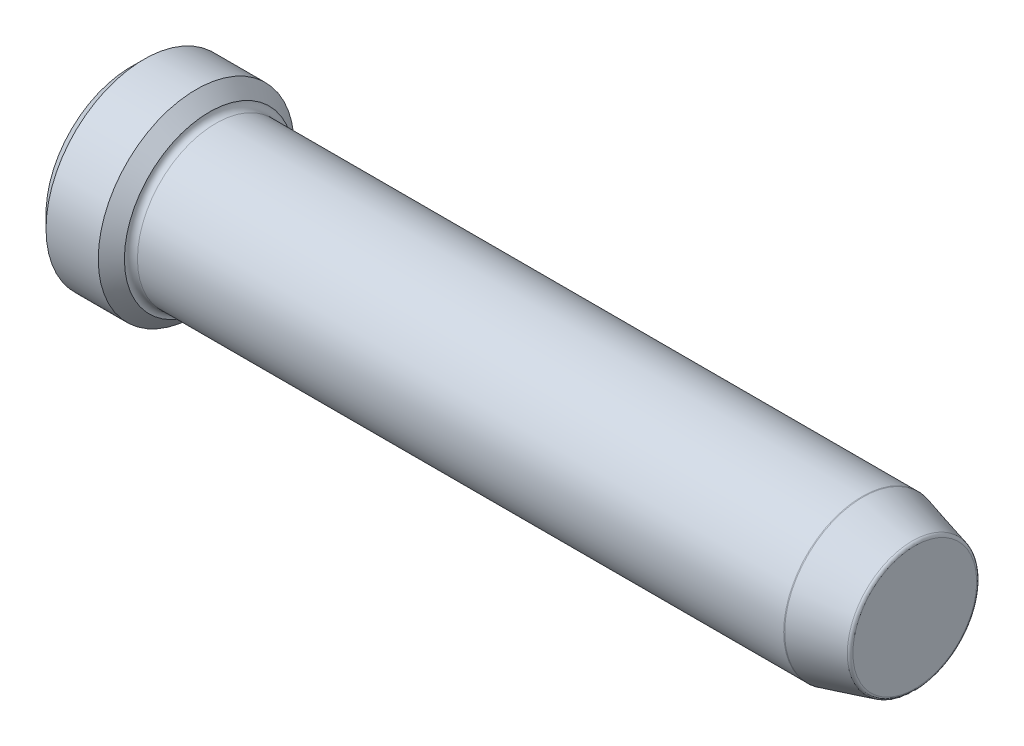
ISO-10303-21;
HEADER;
FILE_DESCRIPTION(('STEP AP214'),'2;1');
FILE_NAME('part.step','',(''),(''),'','','');
FILE_SCHEMA(('AUTOMOTIVE_DESIGN { 1 0 10303 214 1 1 1 1 }'));
ENDSEC;
DATA;
#1=APPLICATION_CONTEXT('core data for automotive mechanical design processes');
#2=APPLICATION_PROTOCOL_DEFINITION('international standard','automotive_design',2000,#1);
#3=PRODUCT_CONTEXT('',#1,'mechanical');
#4=PRODUCT('Part','Part','',(#3));
#5=PRODUCT_RELATED_PRODUCT_CATEGORY('part','',(#4));
#6=PRODUCT_DEFINITION_FORMATION('','',#4);
#7=PRODUCT_DEFINITION_CONTEXT('part definition',#1,'design');
#8=PRODUCT_DEFINITION('design','',#6,#7);
#9=PRODUCT_DEFINITION_SHAPE('','',#8);
#10=(LENGTH_UNIT() NAMED_UNIT(*) SI_UNIT(.MILLI.,.METRE.));
#11=(NAMED_UNIT(*) PLANE_ANGLE_UNIT() SI_UNIT($,.RADIAN.));
#12=(NAMED_UNIT(*) SI_UNIT($,.STERADIAN.) SOLID_ANGLE_UNIT());
#13=UNCERTAINTY_MEASURE_WITH_UNIT(LENGTH_MEASURE(1.E-05),#10,'distance_accuracy_value','');
#14=(GEOMETRIC_REPRESENTATION_CONTEXT(3) GLOBAL_UNCERTAINTY_ASSIGNED_CONTEXT((#13)) GLOBAL_UNIT_ASSIGNED_CONTEXT((#10,
#11,#12)) REPRESENTATION_CONTEXT('',''));
#15=CARTESIAN_POINT('',(0.,0.,0.));
#16=DIRECTION('',(0.,0.,1.));
#17=DIRECTION('',(1.,0.,0.));
#18=AXIS2_PLACEMENT_3D('',#15,#16,#17);
#19=CARTESIAN_POINT('',(0.,0.,0.));
#20=DIRECTION('',(1.,0.,0.));
#21=DIRECTION('',(0.,0.,-1.));
#22=AXIS2_PLACEMENT_3D('',#19,#20,#21);
#23=PLANE('',#22);
#24=CARTESIAN_POINT('',(0.,0.,0.));
#25=DIRECTION('',(1.,0.,0.));
#26=DIRECTION('',(0.,0.,-1.));
#27=AXIS2_PLACEMENT_3D('',#24,#25,#26);
#28=CIRCLE('',#27,6.49999999999999);
#29=CARTESIAN_POINT('',(0.,0.,-6.49999999999999));
#30=VERTEX_POINT('',#29);
#31=EDGE_CURVE('E55',#30,#30,#28,.F.);
#32=ORIENTED_EDGE('',*,*,#31,.T.);
#33=EDGE_LOOP('',(#32));
#34=FACE_BOUND('',#33,.T.);
#35=ADVANCED_FACE('F32',(#34),#23,.F.);
#36=CARTESIAN_POINT('',(-70.6544320312866,0.,0.));
#37=DIRECTION('',(-1.,0.,0.));
#38=DIRECTION('',(0.,0.,1.));
#39=AXIS2_PLACEMENT_3D('',#36,#37,#38);
#40=CYLINDRICAL_SURFACE('',#39,7.5);
#41=CARTESIAN_POINT('',(4.99999999999999,0.,0.));
#42=DIRECTION('',(-1.,0.,0.));
#43=DIRECTION('',(0.,0.,1.));
#44=AXIS2_PLACEMENT_3D('',#41,#42,#43);
#45=CIRCLE('',#44,7.5);
#46=CARTESIAN_POINT('',(4.99999999999999,0.,7.5));
#47=VERTEX_POINT('',#46);
#48=EDGE_CURVE('E61',#47,#47,#45,.T.);
#49=ORIENTED_EDGE('',*,*,#48,.T.);
#50=EDGE_LOOP('',(#49));
#51=FACE_BOUND('',#50,.T.);
#52=CARTESIAN_POINT('',(1.00000000000001,0.,0.));
#53=DIRECTION('',(1.,0.,0.));
#54=DIRECTION('',(0.,0.,-1.));
#55=AXIS2_PLACEMENT_3D('',#52,#53,#54);
#56=CIRCLE('',#55,7.5);
#57=CARTESIAN_POINT('',(1.00000000000001,0.,-7.5));
#58=VERTEX_POINT('',#57);
#59=EDGE_CURVE('E64',#58,#58,#56,.T.);
#60=ORIENTED_EDGE('',*,*,#59,.T.);
#61=EDGE_LOOP('',(#60));
#62=FACE_BOUND('',#61,.T.);
#63=ADVANCED_FACE('F68',(#51,#62),#40,.T.);
#64=CARTESIAN_POINT('',(-70.6544320312866,0.,0.));
#65=DIRECTION('',(-1.,0.,0.));
#66=DIRECTION('',(0.,0.,1.));
#67=AXIS2_PLACEMENT_3D('',#64,#65,#66);
#68=CYLINDRICAL_SURFACE('',#67,6.);
#69=CARTESIAN_POINT('',(55.9670868756031,0.,0.));
#70=DIRECTION('',(1.,0.,0.));
#71=DIRECTION('',(0.,0.,-1.));
#72=AXIS2_PLACEMENT_3D('',#69,#70,#71);
#73=CIRCLE('',#72,6.);
#74=CARTESIAN_POINT('',(55.9670868756031,0.,-6.));
#75=VERTEX_POINT('',#74);
#76=EDGE_CURVE('E10',#75,#75,#73,.F.);
#77=ORIENTED_EDGE('',*,*,#76,.T.);
#78=EDGE_LOOP('',(#77));
#79=FACE_BOUND('',#78,.T.);
#80=CARTESIAN_POINT('',(6.50000000000001,0.,0.));
#81=DIRECTION('',(-1.,0.,0.));
#82=DIRECTION('',(0.,0.,1.));
#83=AXIS2_PLACEMENT_3D('',#80,#81,#82);
#84=CIRCLE('',#83,6.);
#85=CARTESIAN_POINT('',(6.50000000000001,0.,6.));
#86=VERTEX_POINT('',#85);
#87=EDGE_CURVE('E52',#86,#86,#84,.F.);
#88=ORIENTED_EDGE('',*,*,#87,.T.);
#89=EDGE_LOOP('',(#88));
#90=FACE_BOUND('',#89,.T.);
#91=ADVANCED_FACE('F83',(#79,#90),#68,.T.);
#92=CARTESIAN_POINT('',(60.,0.,0.));
#93=DIRECTION('',(-1.,0.,0.));
#94=DIRECTION('',(0.,0.,1.));
#95=AXIS2_PLACEMENT_3D('',#92,#93,#94);
#96=CONICAL_SURFACE('',#95,4.9282032302755,0.26179938779915);
#97=CARTESIAN_POINT('',(59.8147047612756,0.,0.));
#98=DIRECTION('',(1.,0.,0.));
#99=DIRECTION('',(0.,0.,-1.));
#100=AXIS2_PLACEMENT_3D('',#97,#98,#99);
#101=CIRCLE('',#100,4.97785293985303);
#102=CARTESIAN_POINT('',(59.8147047612756,0.,-4.97785293985303));
#103=VERTEX_POINT('',#102);
#104=EDGE_CURVE('E43',#103,#103,#101,.F.);
#105=ORIENTED_EDGE('',*,*,#104,.T.);
#106=EDGE_LOOP('',(#105));
#107=FACE_BOUND('',#106,.T.);
#108=CARTESIAN_POINT('',(56.0317916368788,0.,0.));
#109=DIRECTION('',(1.,0.,0.));
#110=DIRECTION('',(0.,0.,-1.));
#111=AXIS2_PLACEMENT_3D('',#108,#109,#110);
#112=CIRCLE('',#111,5.99148145657226);
#113=CARTESIAN_POINT('',(56.0317916368788,0.,-5.99148145657226));
#114=VERTEX_POINT('',#113);
#115=EDGE_CURVE('E47',#114,#114,#112,.T.);
#116=ORIENTED_EDGE('',*,*,#115,.T.);
#117=EDGE_LOOP('',(#116));
#118=FACE_BOUND('',#117,.T.);
#119=ADVANCED_FACE('F105',(#107,#118),#96,.T.);
#120=CARTESIAN_POINT('',(60.,4.9282032302755,0.));
#121=DIRECTION('',(-1.,0.,0.));
#122=DIRECTION('',(0.,0.,1.));
#123=AXIS2_PLACEMENT_3D('',#120,#121,#122);
#124=PLANE('',#123);
#125=CARTESIAN_POINT('',(60.,0.,0.));
#126=DIRECTION('',(-1.,0.,0.));
#127=DIRECTION('',(0.,0.,1.));
#128=AXIS2_PLACEMENT_3D('',#125,#126,#127);
#129=CIRCLE('',#128,4.73637148328076);
#130=CARTESIAN_POINT('',(60.,0.,4.73637148328076));
#131=VERTEX_POINT('',#130);
#132=EDGE_CURVE('E39',#131,#131,#129,.F.);
#133=ORIENTED_EDGE('',*,*,#132,.T.);
#134=EDGE_LOOP('',(#133));
#135=FACE_BOUND('',#134,.T.);
#136=ADVANCED_FACE('F89',(#135),#124,.F.);
#137=CARTESIAN_POINT('',(4.99999999999999,0.,0.));
#138=DIRECTION('',(-1.,0.,0.));
#139=DIRECTION('',(0.,0.,1.));
#140=AXIS2_PLACEMENT_3D('',#137,#138,#139);
#141=CONICAL_SURFACE('',#140,7.5,0.785398163397451);
#142=CARTESIAN_POINT('',(6.,0.,0.));
#143=DIRECTION('',(-1.,0.,0.));
#144=DIRECTION('',(0.,0.,1.));
#145=AXIS2_PLACEMENT_3D('',#142,#143,#144);
#146=CIRCLE('',#145,6.49999999999998);
#147=CARTESIAN_POINT('',(6.,0.,6.49999999999998));
#148=VERTEX_POINT('',#147);
#149=EDGE_CURVE('E58',#148,#148,#146,.F.);
#150=ORIENTED_EDGE('',*,*,#149,.F.);
#151=EDGE_LOOP('',(#150));
#152=FACE_BOUND('',#151,.T.);
#153=ORIENTED_EDGE('',*,*,#48,.F.);
#154=EDGE_LOOP('',(#153));
#155=FACE_BOUND('',#154,.T.);
#156=ADVANCED_FACE('F74',(#152,#155),#141,.T.);
#157=CARTESIAN_POINT('',(0.,0.,0.));
#158=DIRECTION('',(1.,0.,0.));
#159=DIRECTION('',(0.,0.,-1.));
#160=AXIS2_PLACEMENT_3D('',#157,#158,#159);
#161=CONICAL_SURFACE('',#160,6.49999999999999,0.785398163397445);
#162=ORIENTED_EDGE('',*,*,#59,.F.);
#163=EDGE_LOOP('',(#162));
#164=FACE_BOUND('',#163,.T.);
#165=ORIENTED_EDGE('',*,*,#31,.F.);
#166=EDGE_LOOP('',(#165));
#167=FACE_BOUND('',#166,.T.);
#168=ADVANCED_FACE('F70',(#164,#167),#161,.T.);
#169=CARTESIAN_POINT('',(6.50000000000001,0.,0.));
#170=DIRECTION('',(-1.,0.,0.));
#171=DIRECTION('',(0.,0.,1.));
#172=AXIS2_PLACEMENT_3D('',#169,#170,#171);
#173=TOROIDAL_SURFACE('',#172,6.5,0.5);
#174=ORIENTED_EDGE('',*,*,#87,.F.);
#175=EDGE_LOOP('',(#174));
#176=FACE_BOUND('',#175,.T.);
#177=ORIENTED_EDGE('',*,*,#149,.T.);
#178=EDGE_LOOP('',(#177));
#179=FACE_BOUND('',#178,.T.);
#180=ADVANCED_FACE('F73',(#176,#179),#173,.F.);
#181=CARTESIAN_POINT('',(59.75,0.,0.));
#182=DIRECTION('',(-1.,0.,0.));
#183=DIRECTION('',(0.,0.,1.));
#184=AXIS2_PLACEMENT_3D('',#181,#182,#183);
#185=TOROIDAL_SURFACE('',#184,4.73637148328076,0.25);
#186=ORIENTED_EDGE('',*,*,#132,.F.);
#187=EDGE_LOOP('',(#186));
#188=FACE_BOUND('',#187,.T.);
#189=ORIENTED_EDGE('',*,*,#104,.F.);
#190=EDGE_LOOP('',(#189));
#191=FACE_BOUND('',#190,.T.);
#192=ADVANCED_FACE('F93',(#188,#191),#185,.T.);
#193=CARTESIAN_POINT('',(55.9670868756031,0.,0.));
#194=DIRECTION('',(1.,0.,0.));
#195=DIRECTION('',(0.,0.,-1.));
#196=AXIS2_PLACEMENT_3D('',#193,#194,#195);
#197=TOROIDAL_SURFACE('',#196,5.75,0.25);
#198=ORIENTED_EDGE('',*,*,#115,.F.);
#199=EDGE_LOOP('',(#198));
#200=FACE_BOUND('',#199,.T.);
#201=ORIENTED_EDGE('',*,*,#76,.F.);
#202=EDGE_LOOP('',(#201));
#203=FACE_BOUND('',#202,.T.);
#204=ADVANCED_FACE('F34',(#200,#203),#197,.T.);
#205=CLOSED_SHELL('',(#35,#63,#91,#119,#136,#156,#168,#180,#192,#204));
#206=MANIFOLD_SOLID_BREP('B2',#205);
#207=ADVANCED_BREP_SHAPE_REPRESENTATION('',(#18,#206),#14);
#208=SHAPE_DEFINITION_REPRESENTATION(#9,#207);
ENDSEC;
END-ISO-10303-21;
